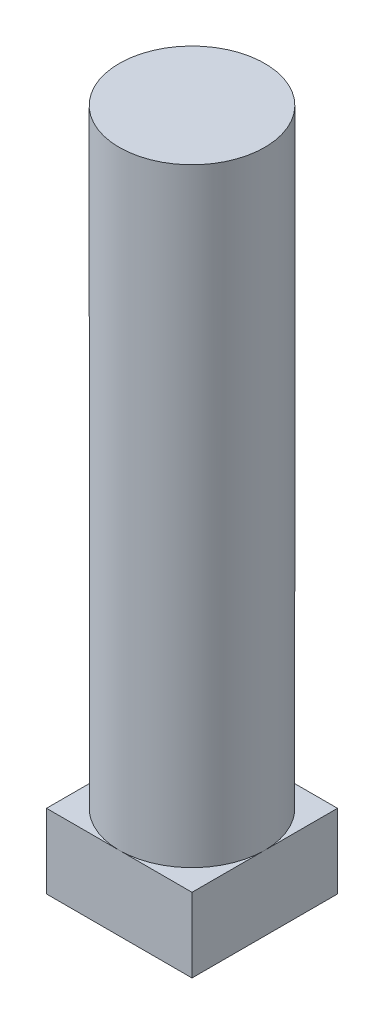
ISO-10303-21;
HEADER;
FILE_DESCRIPTION(('STEP AP214'),'2;1');
FILE_NAME('part.step','',(''),(''),'','','');
FILE_SCHEMA(('AUTOMOTIVE_DESIGN { 1 0 10303 214 1 1 1 1 }'));
ENDSEC;
DATA;
#1=APPLICATION_CONTEXT('core data for automotive mechanical design processes');
#2=APPLICATION_PROTOCOL_DEFINITION('international standard','automotive_design',2000,#1);
#3=PRODUCT_CONTEXT('',#1,'mechanical');
#4=PRODUCT('Part','Part','',(#3));
#5=PRODUCT_RELATED_PRODUCT_CATEGORY('part','',(#4));
#6=PRODUCT_DEFINITION_FORMATION('','',#4);
#7=PRODUCT_DEFINITION_CONTEXT('part definition',#1,'design');
#8=PRODUCT_DEFINITION('design','',#6,#7);
#9=PRODUCT_DEFINITION_SHAPE('','',#8);
#10=(LENGTH_UNIT() NAMED_UNIT(*) SI_UNIT(.MILLI.,.METRE.));
#11=(NAMED_UNIT(*) PLANE_ANGLE_UNIT() SI_UNIT($,.RADIAN.));
#12=(NAMED_UNIT(*) SI_UNIT($,.STERADIAN.) SOLID_ANGLE_UNIT());
#13=UNCERTAINTY_MEASURE_WITH_UNIT(LENGTH_MEASURE(1.E-05),#10,'distance_accuracy_value','');
#14=(GEOMETRIC_REPRESENTATION_CONTEXT(3) GLOBAL_UNCERTAINTY_ASSIGNED_CONTEXT((#13)) GLOBAL_UNIT_ASSIGNED_CONTEXT((#10,
#11,#12)) REPRESENTATION_CONTEXT('',''));
#15=CARTESIAN_POINT('',(0.,0.,0.));
#16=DIRECTION('',(0.,0.,1.));
#17=DIRECTION('',(1.,0.,0.));
#18=AXIS2_PLACEMENT_3D('',#15,#16,#17);
#19=CARTESIAN_POINT('',(0.,2.5,0.));
#20=DIRECTION('',(0.,1.,0.));
#21=DIRECTION('',(0.,0.,1.));
#22=AXIS2_PLACEMENT_3D('',#19,#20,#21);
#23=PLANE('',#22);
#24=CARTESIAN_POINT('',(0.,2.5,0.));
#25=DIRECTION('',(0.,1.,0.));
#26=DIRECTION('',(0.,0.,1.));
#27=AXIS2_PLACEMENT_3D('',#24,#25,#26);
#28=CIRCLE('',#27,2.45);
#29=CARTESIAN_POINT('',(0.,2.5,2.45));
#30=VERTEX_POINT('',#29);
#31=CARTESIAN_POINT('',(2.45,2.5,0.));
#32=VERTEX_POINT('',#31);
#33=EDGE_CURVE('E55',#30,#32,#28,.T.);
#34=ORIENTED_EDGE('',*,*,#33,.F.);
#35=DIRECTION('',(1.,0.,0.));
#36=VECTOR('',#35,1.);
#37=CARTESIAN_POINT('',(-2.45,2.5,2.45));
#38=LINE('',#37,#36);
#39=CARTESIAN_POINT('',(2.45,2.5,2.45));
#40=VERTEX_POINT('',#39);
#41=EDGE_CURVE('E107',#30,#40,#38,.T.);
#42=ORIENTED_EDGE('',*,*,#41,.T.);
#43=DIRECTION('',(0.,0.,-1.));
#44=VECTOR('',#43,1.);
#45=CARTESIAN_POINT('',(2.45,2.5,2.45));
#46=LINE('',#45,#44);
#47=EDGE_CURVE('E119',#40,#32,#46,.T.);
#48=ORIENTED_EDGE('',*,*,#47,.T.);
#49=EDGE_LOOP('',(#34,#42,#48));
#50=FACE_BOUND('',#49,.T.);
#51=ADVANCED_FACE('F43',(#50),#23,.T.);
#52=CARTESIAN_POINT('',(0.,2.5,-2.45));
#53=VERTEX_POINT('',#52);
#54=EDGE_CURVE('E11',#32,#53,#28,.T.);
#55=ORIENTED_EDGE('',*,*,#54,.F.);
#56=CARTESIAN_POINT('',(2.45,2.5,-2.45));
#57=VERTEX_POINT('',#56);
#58=EDGE_CURVE('E106',#32,#57,#46,.T.);
#59=ORIENTED_EDGE('',*,*,#58,.T.);
#60=DIRECTION('',(1.,0.,0.));
#61=VECTOR('',#60,1.);
#62=CARTESIAN_POINT('',(-2.45,2.5,-2.45));
#63=LINE('',#62,#61);
#64=EDGE_CURVE('E132',#53,#57,#63,.T.);
#65=ORIENTED_EDGE('',*,*,#64,.F.);
#66=EDGE_LOOP('',(#55,#59,#65));
#67=FACE_BOUND('',#66,.T.);
#68=ADVANCED_FACE('F195',(#67),#23,.T.);
#69=CARTESIAN_POINT('',(-2.45,2.5,0.));
#70=VERTEX_POINT('',#69);
#71=EDGE_CURVE('E53',#53,#70,#28,.T.);
#72=ORIENTED_EDGE('',*,*,#71,.F.);
#73=CARTESIAN_POINT('',(-2.45,2.5,-2.45));
#74=VERTEX_POINT('',#73);
#75=EDGE_CURVE('E133',#74,#53,#63,.T.);
#76=ORIENTED_EDGE('',*,*,#75,.F.);
#77=DIRECTION('',(0.,0.,-1.));
#78=VECTOR('',#77,1.);
#79=CARTESIAN_POINT('',(-2.45,2.5,2.45));
#80=LINE('',#79,#78);
#81=EDGE_CURVE('E137',#70,#74,#80,.T.);
#82=ORIENTED_EDGE('',*,*,#81,.F.);
#83=EDGE_LOOP('',(#72,#76,#82));
#84=FACE_BOUND('',#83,.T.);
#85=ADVANCED_FACE('F175',(#84),#23,.T.);
#86=CARTESIAN_POINT('',(-2.45,2.5,2.45));
#87=DIRECTION('',(0.,0.,-1.));
#88=DIRECTION('',(-1.,0.,0.));
#89=AXIS2_PLACEMENT_3D('',#86,#87,#88);
#90=PLANE('',#89);
#91=DIRECTION('',(1.,0.,0.));
#92=VECTOR('',#91,1.);
#93=CARTESIAN_POINT('',(-2.45,0.,2.45));
#94=LINE('',#93,#92);
#95=CARTESIAN_POINT('',(-2.45,0.,2.45));
#96=VERTEX_POINT('',#95);
#97=CARTESIAN_POINT('',(2.45,0.,2.45));
#98=VERTEX_POINT('',#97);
#99=EDGE_CURVE('E141',#96,#98,#94,.T.);
#100=ORIENTED_EDGE('',*,*,#99,.T.);
#101=DIRECTION('',(0.,-1.,0.));
#102=VECTOR('',#101,1.);
#103=CARTESIAN_POINT('',(2.45,2.5,2.45));
#104=LINE('',#103,#102);
#105=EDGE_CURVE('E47',#40,#98,#104,.T.);
#106=ORIENTED_EDGE('',*,*,#105,.F.);
#107=ORIENTED_EDGE('',*,*,#41,.F.);
#108=CARTESIAN_POINT('',(-2.45,2.5,2.45));
#109=VERTEX_POINT('',#108);
#110=EDGE_CURVE('E99',#109,#30,#38,.T.);
#111=ORIENTED_EDGE('',*,*,#110,.F.);
#112=DIRECTION('',(0.,-1.,0.));
#113=VECTOR('',#112,1.);
#114=CARTESIAN_POINT('',(-2.45,2.5,2.45));
#115=LINE('',#114,#113);
#116=EDGE_CURVE('E140',#109,#96,#115,.T.);
#117=ORIENTED_EDGE('',*,*,#116,.T.);
#118=EDGE_LOOP('',(#100,#106,#107,#111,#117));
#119=FACE_BOUND('',#118,.T.);
#120=ADVANCED_FACE('F45',(#119),#90,.F.);
#121=CARTESIAN_POINT('',(2.45,2.5,2.45));
#122=DIRECTION('',(-1.,0.,0.));
#123=DIRECTION('',(0.,0.,1.));
#124=AXIS2_PLACEMENT_3D('',#121,#122,#123);
#125=PLANE('',#124);
#126=DIRECTION('',(0.,0.,-1.));
#127=VECTOR('',#126,1.);
#128=CARTESIAN_POINT('',(2.45,0.,2.45));
#129=LINE('',#128,#127);
#130=CARTESIAN_POINT('',(2.45,0.,-2.45));
#131=VERTEX_POINT('',#130);
#132=EDGE_CURVE('E144',#98,#131,#129,.T.);
#133=ORIENTED_EDGE('',*,*,#132,.T.);
#134=DIRECTION('',(0.,-1.,0.));
#135=VECTOR('',#134,1.);
#136=CARTESIAN_POINT('',(2.45,2.5,-2.45));
#137=LINE('',#136,#135);
#138=EDGE_CURVE('E127',#57,#131,#137,.T.);
#139=ORIENTED_EDGE('',*,*,#138,.F.);
#140=ORIENTED_EDGE('',*,*,#58,.F.);
#141=ORIENTED_EDGE('',*,*,#47,.F.);
#142=ORIENTED_EDGE('',*,*,#105,.T.);
#143=EDGE_LOOP('',(#133,#139,#140,#141,#142));
#144=FACE_BOUND('',#143,.T.);
#145=ADVANCED_FACE('F168',(#144),#125,.F.);
#146=CARTESIAN_POINT('',(-2.45,2.5,-2.45));
#147=DIRECTION('',(0.,0.,-1.));
#148=DIRECTION('',(-1.,0.,0.));
#149=AXIS2_PLACEMENT_3D('',#146,#147,#148);
#150=PLANE('',#149);
#151=DIRECTION('',(1.,0.,0.));
#152=VECTOR('',#151,1.);
#153=CARTESIAN_POINT('',(-2.45,0.,-2.45));
#154=LINE('',#153,#152);
#155=CARTESIAN_POINT('',(-2.45,0.,-2.45));
#156=VERTEX_POINT('',#155);
#157=EDGE_CURVE('E148',#156,#131,#154,.T.);
#158=ORIENTED_EDGE('',*,*,#157,.F.);
#159=DIRECTION('',(0.,-1.,0.));
#160=VECTOR('',#159,1.);
#161=CARTESIAN_POINT('',(-2.45,2.5,-2.45));
#162=LINE('',#161,#160);
#163=EDGE_CURVE('E157',#74,#156,#162,.T.);
#164=ORIENTED_EDGE('',*,*,#163,.F.);
#165=ORIENTED_EDGE('',*,*,#75,.T.);
#166=ORIENTED_EDGE('',*,*,#64,.T.);
#167=ORIENTED_EDGE('',*,*,#138,.T.);
#168=EDGE_LOOP('',(#158,#164,#165,#166,#167));
#169=FACE_BOUND('',#168,.T.);
#170=ADVANCED_FACE('F163',(#169),#150,.T.);
#171=CARTESIAN_POINT('',(-2.45,2.5,2.45));
#172=DIRECTION('',(-1.,0.,0.));
#173=DIRECTION('',(0.,0.,1.));
#174=AXIS2_PLACEMENT_3D('',#171,#172,#173);
#175=PLANE('',#174);
#176=DIRECTION('',(0.,0.,-1.));
#177=VECTOR('',#176,1.);
#178=CARTESIAN_POINT('',(-2.45,0.,2.45));
#179=LINE('',#178,#177);
#180=EDGE_CURVE('E117',#96,#156,#179,.T.);
#181=ORIENTED_EDGE('',*,*,#180,.F.);
#182=ORIENTED_EDGE('',*,*,#116,.F.);
#183=EDGE_CURVE('E103',#109,#70,#80,.T.);
#184=ORIENTED_EDGE('',*,*,#183,.T.);
#185=ORIENTED_EDGE('',*,*,#81,.T.);
#186=ORIENTED_EDGE('',*,*,#163,.T.);
#187=EDGE_LOOP('',(#181,#182,#184,#185,#186));
#188=FACE_BOUND('',#187,.T.);
#189=ADVANCED_FACE('F174',(#188),#175,.T.);
#190=EDGE_CURVE('E62',#70,#30,#28,.T.);
#191=ORIENTED_EDGE('',*,*,#190,.F.);
#192=ORIENTED_EDGE('',*,*,#183,.F.);
#193=ORIENTED_EDGE('',*,*,#110,.T.);
#194=EDGE_LOOP('',(#191,#192,#193));
#195=FACE_BOUND('',#194,.T.);
#196=ADVANCED_FACE('F101',(#195),#23,.T.);
#197=CARTESIAN_POINT('',(0.,0.,0.));
#198=DIRECTION('',(0.,1.,0.));
#199=DIRECTION('',(0.,0.,1.));
#200=AXIS2_PLACEMENT_3D('',#197,#198,#199);
#201=PLANE('',#200);
#202=ORIENTED_EDGE('',*,*,#99,.F.);
#203=ORIENTED_EDGE('',*,*,#180,.T.);
#204=ORIENTED_EDGE('',*,*,#157,.T.);
#205=ORIENTED_EDGE('',*,*,#132,.F.);
#206=EDGE_LOOP('',(#202,#203,#204,#205));
#207=FACE_BOUND('',#206,.T.);
#208=ADVANCED_FACE('F171',(#207),#201,.F.);
#209=CARTESIAN_POINT('',(0.,23.,0.));
#210=DIRECTION('',(0.,-1.,0.));
#211=DIRECTION('',(0.,0.,-1.));
#212=AXIS2_PLACEMENT_3D('',#209,#210,#211);
#213=CYLINDRICAL_SURFACE('',#212,2.45);
#214=CARTESIAN_POINT('',(0.,23.,0.));
#215=DIRECTION('',(0.,1.,0.));
#216=DIRECTION('',(0.,0.,1.));
#217=AXIS2_PLACEMENT_3D('',#214,#215,#216);
#218=CIRCLE('',#217,2.45);
#219=CARTESIAN_POINT('',(0.,23.,2.45));
#220=VERTEX_POINT('',#219);
#221=EDGE_CURVE('E122',#220,#220,#218,.T.);
#222=ORIENTED_EDGE('',*,*,#221,.F.);
#223=EDGE_LOOP('',(#222));
#224=FACE_BOUND('',#223,.T.);
#225=ORIENTED_EDGE('',*,*,#33,.T.);
#226=ORIENTED_EDGE('',*,*,#54,.T.);
#227=ORIENTED_EDGE('',*,*,#71,.T.);
#228=ORIENTED_EDGE('',*,*,#190,.T.);
#229=EDGE_LOOP('',(#225,#226,#227,#228));
#230=FACE_BOUND('',#229,.T.);
#231=ADVANCED_FACE('F123',(#224,#230),#213,.T.);
#232=CARTESIAN_POINT('',(0.,23.,0.));
#233=DIRECTION('',(0.,1.,0.));
#234=DIRECTION('',(0.,0.,1.));
#235=AXIS2_PLACEMENT_3D('',#232,#233,#234);
#236=PLANE('',#235);
#237=ORIENTED_EDGE('',*,*,#221,.T.);
#238=EDGE_LOOP('',(#237));
#239=FACE_BOUND('',#238,.T.);
#240=ADVANCED_FACE('F183',(#239),#236,.T.);
#241=CLOSED_SHELL('',(#51,#68,#85,#120,#145,#170,#189,#196,#208,#231,#240));
#242=MANIFOLD_SOLID_BREP('B2',#241);
#243=ADVANCED_BREP_SHAPE_REPRESENTATION('',(#18,#242),#14);
#244=SHAPE_DEFINITION_REPRESENTATION(#9,#243);
ENDSEC;
END-ISO-10303-21;
